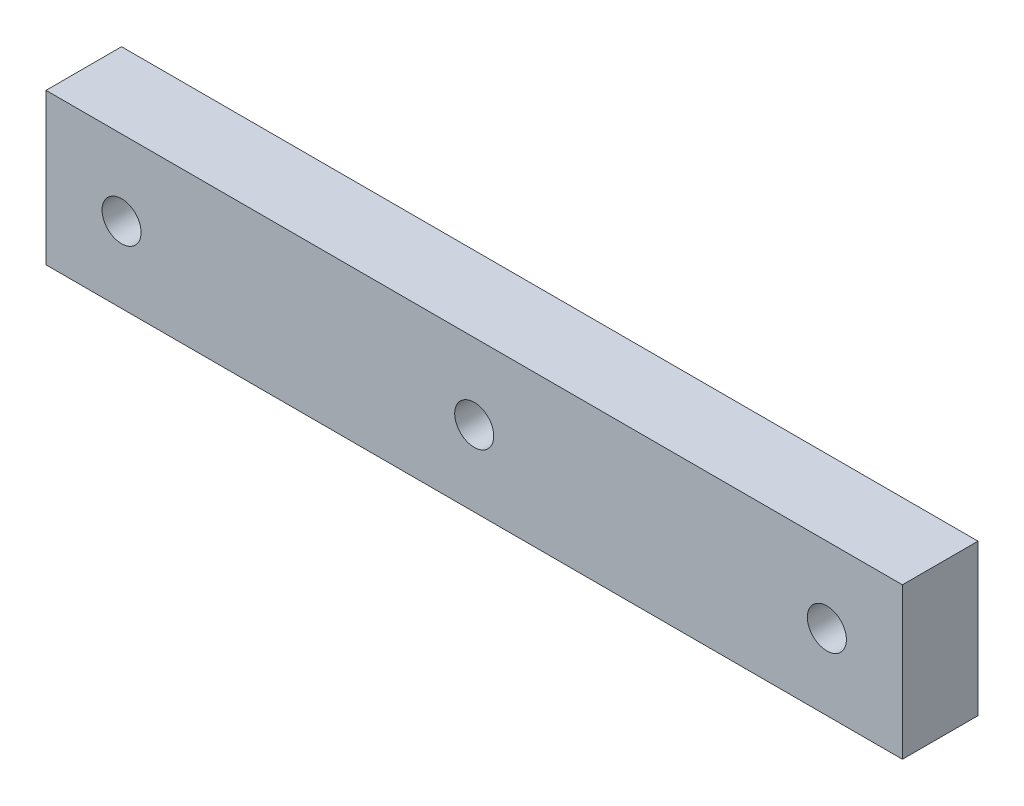
ISO-10303-21;
HEADER;
FILE_DESCRIPTION(('STEP AP214'),'2;1');
FILE_NAME('part.step','',(''),(''),'','','');
FILE_SCHEMA(('AUTOMOTIVE_DESIGN { 1 0 10303 214 1 1 1 1 }'));
ENDSEC;
DATA;
#1=APPLICATION_CONTEXT('core data for automotive mechanical design processes');
#2=APPLICATION_PROTOCOL_DEFINITION('international standard','automotive_design',2000,#1);
#3=PRODUCT_CONTEXT('',#1,'mechanical');
#4=PRODUCT('Part','Part','',(#3));
#5=PRODUCT_RELATED_PRODUCT_CATEGORY('part','',(#4));
#6=PRODUCT_DEFINITION_FORMATION('','',#4);
#7=PRODUCT_DEFINITION_CONTEXT('part definition',#1,'design');
#8=PRODUCT_DEFINITION('design','',#6,#7);
#9=PRODUCT_DEFINITION_SHAPE('','',#8);
#10=(LENGTH_UNIT() NAMED_UNIT(*) SI_UNIT(.MILLI.,.METRE.));
#11=(NAMED_UNIT(*) PLANE_ANGLE_UNIT() SI_UNIT($,.RADIAN.));
#12=(NAMED_UNIT(*) SI_UNIT($,.STERADIAN.) SOLID_ANGLE_UNIT());
#13=UNCERTAINTY_MEASURE_WITH_UNIT(LENGTH_MEASURE(1.E-05),#10,'distance_accuracy_value','');
#14=(GEOMETRIC_REPRESENTATION_CONTEXT(3) GLOBAL_UNCERTAINTY_ASSIGNED_CONTEXT((#13)) GLOBAL_UNIT_ASSIGNED_CONTEXT((#10,
#11,#12)) REPRESENTATION_CONTEXT('',''));
#15=CARTESIAN_POINT('',(0.,0.,0.));
#16=DIRECTION('',(0.,0.,1.));
#17=DIRECTION('',(1.,0.,0.));
#18=AXIS2_PLACEMENT_3D('',#15,#16,#17);
#19=CARTESIAN_POINT('',(115.201456631758,17.7039696358885,6.));
#20=DIRECTION('',(-1.,0.,0.));
#21=DIRECTION('',(0.,0.,1.));
#22=AXIS2_PLACEMENT_3D('',#19,#20,#21);
#23=PLANE('',#22);
#24=DIRECTION('',(0.,1.,0.));
#25=VECTOR('',#24,1.);
#26=CARTESIAN_POINT('',(115.201456631758,17.7039696358885,0.));
#27=LINE('',#26,#25);
#28=CARTESIAN_POINT('',(115.201456631758,5.70396963588848,0.));
#29=VERTEX_POINT('',#28);
#30=CARTESIAN_POINT('',(115.201456631758,17.7039696358885,0.));
#31=VERTEX_POINT('',#30);
#32=EDGE_CURVE('E97',#29,#31,#27,.T.);
#33=ORIENTED_EDGE('',*,*,#32,.T.);
#34=DIRECTION('',(0.,0.,-1.));
#35=VECTOR('',#34,1.);
#36=CARTESIAN_POINT('',(115.201456631758,17.7039696358885,6.));
#37=LINE('',#36,#35);
#38=CARTESIAN_POINT('',(115.201456631758,17.7039696358885,6.));
#39=VERTEX_POINT('',#38);
#40=EDGE_CURVE('E11',#39,#31,#37,.T.);
#41=ORIENTED_EDGE('',*,*,#40,.F.);
#42=DIRECTION('',(0.,1.,0.));
#43=VECTOR('',#42,1.);
#44=CARTESIAN_POINT('',(115.201456631758,17.7039696358885,6.));
#45=LINE('',#44,#43);
#46=CARTESIAN_POINT('',(115.201456631758,5.70396963588848,6.));
#47=VERTEX_POINT('',#46);
#48=EDGE_CURVE('E85',#47,#39,#45,.T.);
#49=ORIENTED_EDGE('',*,*,#48,.F.);
#50=DIRECTION('',(0.,0.,-1.));
#51=VECTOR('',#50,1.);
#52=CARTESIAN_POINT('',(115.201456631758,5.70396963588848,6.));
#53=LINE('',#52,#51);
#54=EDGE_CURVE('E93',#47,#29,#53,.T.);
#55=ORIENTED_EDGE('',*,*,#54,.T.);
#56=EDGE_LOOP('',(#33,#41,#49,#55));
#57=FACE_BOUND('',#56,.T.);
#58=ADVANCED_FACE('F34',(#57),#23,.F.);
#59=CARTESIAN_POINT('',(115.201456631758,17.7039696358885,6.));
#60=DIRECTION('',(0.,-1.,0.));
#61=DIRECTION('',(0.,0.,-1.));
#62=AXIS2_PLACEMENT_3D('',#59,#60,#61);
#63=PLANE('',#62);
#64=DIRECTION('',(-1.,0.,0.));
#65=VECTOR('',#64,1.);
#66=CARTESIAN_POINT('',(115.201456631758,17.7039696358885,0.));
#67=LINE('',#66,#65);
#68=CARTESIAN_POINT('',(47.201456631758,17.7039696358885,0.));
#69=VERTEX_POINT('',#68);
#70=EDGE_CURVE('E89',#31,#69,#67,.T.);
#71=ORIENTED_EDGE('',*,*,#70,.T.);
#72=DIRECTION('',(0.,0.,-1.));
#73=VECTOR('',#72,1.);
#74=CARTESIAN_POINT('',(47.201456631758,17.7039696358885,6.));
#75=LINE('',#74,#73);
#76=CARTESIAN_POINT('',(47.201456631758,17.7039696358885,6.));
#77=VERTEX_POINT('',#76);
#78=EDGE_CURVE('E42',#77,#69,#75,.T.);
#79=ORIENTED_EDGE('',*,*,#78,.F.);
#80=DIRECTION('',(-1.,0.,0.));
#81=VECTOR('',#80,1.);
#82=CARTESIAN_POINT('',(115.201456631758,17.7039696358885,6.));
#83=LINE('',#82,#81);
#84=EDGE_CURVE('E80',#39,#77,#83,.T.);
#85=ORIENTED_EDGE('',*,*,#84,.F.);
#86=ORIENTED_EDGE('',*,*,#40,.T.);
#87=EDGE_LOOP('',(#71,#79,#85,#86));
#88=FACE_BOUND('',#87,.T.);
#89=ADVANCED_FACE('F88',(#88),#63,.F.);
#90=CARTESIAN_POINT('',(47.201456631758,17.7039696358885,6.));
#91=DIRECTION('',(1.,0.,0.));
#92=DIRECTION('',(0.,0.,-1.));
#93=AXIS2_PLACEMENT_3D('',#90,#91,#92);
#94=PLANE('',#93);
#95=DIRECTION('',(0.,-1.,0.));
#96=VECTOR('',#95,1.);
#97=CARTESIAN_POINT('',(47.201456631758,17.7039696358885,0.));
#98=LINE('',#97,#96);
#99=CARTESIAN_POINT('',(47.201456631758,5.70396963588848,0.));
#100=VERTEX_POINT('',#99);
#101=EDGE_CURVE('E67',#69,#100,#98,.T.);
#102=ORIENTED_EDGE('',*,*,#101,.T.);
#103=DIRECTION('',(0.,0.,-1.));
#104=VECTOR('',#103,1.);
#105=CARTESIAN_POINT('',(47.201456631758,5.70396963588848,6.));
#106=LINE('',#105,#104);
#107=CARTESIAN_POINT('',(47.201456631758,5.70396963588848,6.));
#108=VERTEX_POINT('',#107);
#109=EDGE_CURVE('E90',#108,#100,#106,.T.);
#110=ORIENTED_EDGE('',*,*,#109,.F.);
#111=DIRECTION('',(0.,-1.,0.));
#112=VECTOR('',#111,1.);
#113=CARTESIAN_POINT('',(47.201456631758,17.7039696358885,6.));
#114=LINE('',#113,#112);
#115=EDGE_CURVE('E83',#77,#108,#114,.T.);
#116=ORIENTED_EDGE('',*,*,#115,.F.);
#117=ORIENTED_EDGE('',*,*,#78,.T.);
#118=EDGE_LOOP('',(#102,#110,#116,#117));
#119=FACE_BOUND('',#118,.T.);
#120=ADVANCED_FACE('F91',(#119),#94,.F.);
#121=CARTESIAN_POINT('',(115.201456631758,5.70396963588848,6.));
#122=DIRECTION('',(0.,1.,0.));
#123=DIRECTION('',(0.,0.,1.));
#124=AXIS2_PLACEMENT_3D('',#121,#122,#123);
#125=PLANE('',#124);
#126=DIRECTION('',(1.,0.,0.));
#127=VECTOR('',#126,1.);
#128=CARTESIAN_POINT('',(115.201456631758,5.70396963588848,0.));
#129=LINE('',#128,#127);
#130=EDGE_CURVE('E73',#100,#29,#129,.T.);
#131=ORIENTED_EDGE('',*,*,#130,.T.);
#132=ORIENTED_EDGE('',*,*,#54,.F.);
#133=DIRECTION('',(1.,0.,0.));
#134=VECTOR('',#133,1.);
#135=CARTESIAN_POINT('',(115.201456631758,5.70396963588848,6.));
#136=LINE('',#135,#134);
#137=EDGE_CURVE('E50',#108,#47,#136,.T.);
#138=ORIENTED_EDGE('',*,*,#137,.F.);
#139=ORIENTED_EDGE('',*,*,#109,.T.);
#140=EDGE_LOOP('',(#131,#132,#138,#139));
#141=FACE_BOUND('',#140,.T.);
#142=ADVANCED_FACE('F105',(#141),#125,.F.);
#143=CARTESIAN_POINT('',(0.,0.,6.));
#144=DIRECTION('',(0.,0.,-1.));
#145=DIRECTION('',(-1.,0.,0.));
#146=AXIS2_PLACEMENT_3D('',#143,#144,#145);
#147=PLANE('',#146);
#148=CARTESIAN_POINT('',(81.201456631758,11.7039696358885,6.));
#149=DIRECTION('',(0.,0.,1.));
#150=DIRECTION('',(1.,0.,0.));
#151=AXIS2_PLACEMENT_3D('',#148,#149,#150);
#152=CIRCLE('',#151,1.54999999999999);
#153=CARTESIAN_POINT('',(82.751456631758,11.7039696358885,6.));
#154=VERTEX_POINT('',#153);
#155=EDGE_CURVE('E123',#154,#154,#152,.T.);
#156=ORIENTED_EDGE('',*,*,#155,.F.);
#157=EDGE_LOOP('',(#156));
#158=FACE_BOUND('',#157,.T.);
#159=CARTESIAN_POINT('',(53.201456631758,11.7039696358885,6.));
#160=DIRECTION('',(0.,0.,1.));
#161=DIRECTION('',(1.,0.,0.));
#162=AXIS2_PLACEMENT_3D('',#159,#160,#161);
#163=CIRCLE('',#162,1.55);
#164=CARTESIAN_POINT('',(54.751456631758,11.7039696358885,6.));
#165=VERTEX_POINT('',#164);
#166=EDGE_CURVE('E117',#165,#165,#163,.T.);
#167=ORIENTED_EDGE('',*,*,#166,.F.);
#168=EDGE_LOOP('',(#167));
#169=FACE_BOUND('',#168,.T.);
#170=CARTESIAN_POINT('',(109.201456631758,11.7039696358885,6.));
#171=DIRECTION('',(0.,0.,1.));
#172=DIRECTION('',(1.,0.,0.));
#173=AXIS2_PLACEMENT_3D('',#170,#171,#172);
#174=CIRCLE('',#173,1.54999999999999);
#175=CARTESIAN_POINT('',(110.751456631758,11.7039696358885,6.));
#176=VERTEX_POINT('',#175);
#177=EDGE_CURVE('E111',#176,#176,#174,.T.);
#178=ORIENTED_EDGE('',*,*,#177,.F.);
#179=EDGE_LOOP('',(#178));
#180=FACE_BOUND('',#179,.T.);
#181=ORIENTED_EDGE('',*,*,#48,.T.);
#182=ORIENTED_EDGE('',*,*,#84,.T.);
#183=ORIENTED_EDGE('',*,*,#115,.T.);
#184=ORIENTED_EDGE('',*,*,#137,.T.);
#185=EDGE_LOOP('',(#181,#182,#183,#184));
#186=FACE_BOUND('',#185,.T.);
#187=ADVANCED_FACE('F81',(#158,#169,#180,#186),#147,.F.);
#188=CARTESIAN_POINT('',(0.,0.,0.));
#189=DIRECTION('',(0.,0.,-1.));
#190=DIRECTION('',(-1.,0.,0.));
#191=AXIS2_PLACEMENT_3D('',#188,#189,#190);
#192=PLANE('',#191);
#193=CARTESIAN_POINT('',(81.201456631758,11.7039696358885,0.));
#194=DIRECTION('',(0.,0.,1.));
#195=DIRECTION('',(1.,0.,0.));
#196=AXIS2_PLACEMENT_3D('',#193,#194,#195);
#197=CIRCLE('',#196,1.54999999999999);
#198=CARTESIAN_POINT('',(82.751456631758,11.7039696358885,0.));
#199=VERTEX_POINT('',#198);
#200=EDGE_CURVE('E120',#199,#199,#197,.T.);
#201=ORIENTED_EDGE('',*,*,#200,.T.);
#202=EDGE_LOOP('',(#201));
#203=FACE_BOUND('',#202,.T.);
#204=CARTESIAN_POINT('',(53.201456631758,11.7039696358885,0.));
#205=DIRECTION('',(0.,0.,1.));
#206=DIRECTION('',(1.,0.,0.));
#207=AXIS2_PLACEMENT_3D('',#204,#205,#206);
#208=CIRCLE('',#207,1.55);
#209=CARTESIAN_POINT('',(54.751456631758,11.7039696358885,0.));
#210=VERTEX_POINT('',#209);
#211=EDGE_CURVE('E114',#210,#210,#208,.T.);
#212=ORIENTED_EDGE('',*,*,#211,.T.);
#213=EDGE_LOOP('',(#212));
#214=FACE_BOUND('',#213,.T.);
#215=CARTESIAN_POINT('',(109.201456631758,11.7039696358885,0.));
#216=DIRECTION('',(0.,0.,1.));
#217=DIRECTION('',(1.,0.,0.));
#218=AXIS2_PLACEMENT_3D('',#215,#216,#217);
#219=CIRCLE('',#218,1.54999999999999);
#220=CARTESIAN_POINT('',(110.751456631758,11.7039696358885,0.));
#221=VERTEX_POINT('',#220);
#222=EDGE_CURVE('E100',#221,#221,#219,.T.);
#223=ORIENTED_EDGE('',*,*,#222,.T.);
#224=EDGE_LOOP('',(#223));
#225=FACE_BOUND('',#224,.T.);
#226=ORIENTED_EDGE('',*,*,#32,.F.);
#227=ORIENTED_EDGE('',*,*,#130,.F.);
#228=ORIENTED_EDGE('',*,*,#101,.F.);
#229=ORIENTED_EDGE('',*,*,#70,.F.);
#230=EDGE_LOOP('',(#226,#227,#228,#229));
#231=FACE_BOUND('',#230,.T.);
#232=ADVANCED_FACE('F108',(#203,#214,#225,#231),#192,.T.);
#233=CARTESIAN_POINT('',(109.201456631758,11.7039696358885,0.));
#234=DIRECTION('',(0.,0.,1.));
#235=DIRECTION('',(1.,0.,0.));
#236=AXIS2_PLACEMENT_3D('',#233,#234,#235);
#237=CYLINDRICAL_SURFACE('',#236,1.54999999999999);
#238=ORIENTED_EDGE('',*,*,#222,.F.);
#239=EDGE_LOOP('',(#238));
#240=FACE_BOUND('',#239,.T.);
#241=ORIENTED_EDGE('',*,*,#177,.T.);
#242=EDGE_LOOP('',(#241));
#243=FACE_BOUND('',#242,.T.);
#244=ADVANCED_FACE('F145',(#240,#243),#237,.F.);
#245=CARTESIAN_POINT('',(53.201456631758,11.7039696358885,0.));
#246=DIRECTION('',(0.,0.,1.));
#247=DIRECTION('',(1.,0.,0.));
#248=AXIS2_PLACEMENT_3D('',#245,#246,#247);
#249=CYLINDRICAL_SURFACE('',#248,1.55);
#250=ORIENTED_EDGE('',*,*,#211,.F.);
#251=EDGE_LOOP('',(#250));
#252=FACE_BOUND('',#251,.T.);
#253=ORIENTED_EDGE('',*,*,#166,.T.);
#254=EDGE_LOOP('',(#253));
#255=FACE_BOUND('',#254,.T.);
#256=ADVANCED_FACE('F134',(#252,#255),#249,.F.);
#257=CARTESIAN_POINT('',(81.201456631758,11.7039696358885,0.));
#258=DIRECTION('',(0.,0.,1.));
#259=DIRECTION('',(1.,0.,0.));
#260=AXIS2_PLACEMENT_3D('',#257,#258,#259);
#261=CYLINDRICAL_SURFACE('',#260,1.54999999999999);
#262=ORIENTED_EDGE('',*,*,#200,.F.);
#263=EDGE_LOOP('',(#262));
#264=FACE_BOUND('',#263,.T.);
#265=ORIENTED_EDGE('',*,*,#155,.T.);
#266=EDGE_LOOP('',(#265));
#267=FACE_BOUND('',#266,.T.);
#268=ADVANCED_FACE('F131',(#264,#267),#261,.F.);
#269=CLOSED_SHELL('',(#58,#89,#120,#142,#187,#232,#244,#256,#268));
#270=MANIFOLD_SOLID_BREP('B2',#269);
#271=ADVANCED_BREP_SHAPE_REPRESENTATION('',(#18,#270),#14);
#272=SHAPE_DEFINITION_REPRESENTATION(#9,#271);
ENDSEC;
END-ISO-10303-21;
